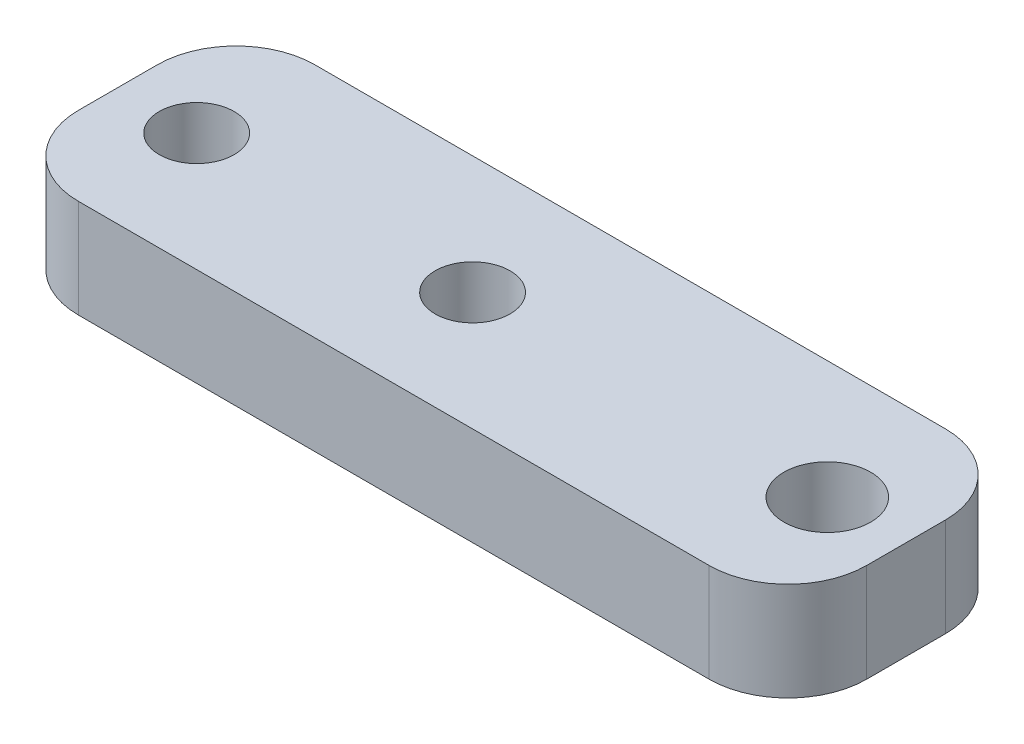
ISO-10303-21;
HEADER;
FILE_DESCRIPTION(('STEP AP214'),'2;1');
FILE_NAME('part.step','',(''),(''),'','','');
FILE_SCHEMA(('AUTOMOTIVE_DESIGN { 1 0 10303 214 1 1 1 1 }'));
ENDSEC;
DATA;
#1=APPLICATION_CONTEXT('core data for automotive mechanical design processes');
#2=APPLICATION_PROTOCOL_DEFINITION('international standard','automotive_design',2000,#1);
#3=PRODUCT_CONTEXT('',#1,'mechanical');
#4=PRODUCT('Part','Part','',(#3));
#5=PRODUCT_RELATED_PRODUCT_CATEGORY('part','',(#4));
#6=PRODUCT_DEFINITION_FORMATION('','',#4);
#7=PRODUCT_DEFINITION_CONTEXT('part definition',#1,'design');
#8=PRODUCT_DEFINITION('design','',#6,#7);
#9=PRODUCT_DEFINITION_SHAPE('','',#8);
#10=(LENGTH_UNIT() NAMED_UNIT(*) SI_UNIT(.MILLI.,.METRE.));
#11=(NAMED_UNIT(*) PLANE_ANGLE_UNIT() SI_UNIT($,.RADIAN.));
#12=(NAMED_UNIT(*) SI_UNIT($,.STERADIAN.) SOLID_ANGLE_UNIT());
#13=UNCERTAINTY_MEASURE_WITH_UNIT(LENGTH_MEASURE(1.E-05),#10,'distance_accuracy_value','');
#14=(GEOMETRIC_REPRESENTATION_CONTEXT(3) GLOBAL_UNCERTAINTY_ASSIGNED_CONTEXT((#13)) GLOBAL_UNIT_ASSIGNED_CONTEXT((#10,
#11,#12)) REPRESENTATION_CONTEXT('',''));
#15=CARTESIAN_POINT('',(0.,0.,0.));
#16=DIRECTION('',(0.,0.,1.));
#17=DIRECTION('',(1.,0.,0.));
#18=AXIS2_PLACEMENT_3D('',#15,#16,#17);
#19=CARTESIAN_POINT('',(10.0305939758537,2.5,0.));
#20=DIRECTION('',(1.,0.,0.));
#21=DIRECTION('',(0.,0.,-1.));
#22=AXIS2_PLACEMENT_3D('',#19,#20,#21);
#23=PLANE('',#22);
#24=DIRECTION('',(0.,0.,1.));
#25=VECTOR('',#24,1.);
#26=CARTESIAN_POINT('',(10.0305939758537,2.5,0.));
#27=LINE('',#26,#25);
#28=CARTESIAN_POINT('',(10.0305939758537,2.5,-4.));
#29=VERTEX_POINT('',#28);
#30=CARTESIAN_POINT('',(10.0305939758537,2.5,-2.));
#31=VERTEX_POINT('',#30);
#32=EDGE_CURVE('E119',#29,#31,#27,.T.);
#33=ORIENTED_EDGE('',*,*,#32,.F.);
#34=DIRECTION('',(0.,-1.,0.));
#35=VECTOR('',#34,1.);
#36=CARTESIAN_POINT('',(10.0305939758537,2.5,-4.));
#37=LINE('',#36,#35);
#38=CARTESIAN_POINT('',(10.0305939758537,0.,-4.));
#39=VERTEX_POINT('',#38);
#40=EDGE_CURVE('E104',#29,#39,#37,.T.);
#41=ORIENTED_EDGE('',*,*,#40,.T.);
#42=DIRECTION('',(0.,0.,1.));
#43=VECTOR('',#42,1.);
#44=CARTESIAN_POINT('',(10.0305939758537,0.,0.));
#45=LINE('',#44,#43);
#46=CARTESIAN_POINT('',(10.0305939758537,0.,-2.));
#47=VERTEX_POINT('',#46);
#48=EDGE_CURVE('E116',#39,#47,#45,.T.);
#49=ORIENTED_EDGE('',*,*,#48,.T.);
#50=DIRECTION('',(0.,-1.,0.));
#51=VECTOR('',#50,1.);
#52=CARTESIAN_POINT('',(10.0305939758537,2.5,-2.));
#53=LINE('',#52,#51);
#54=EDGE_CURVE('E121',#47,#31,#53,.F.);
#55=ORIENTED_EDGE('',*,*,#54,.T.);
#56=EDGE_LOOP('',(#33,#41,#49,#55));
#57=FACE_BOUND('',#56,.T.);
#58=ADVANCED_FACE('F35',(#57),#23,.F.);
#59=CARTESIAN_POINT('',(10.0305939758537,2.5,0.));
#60=DIRECTION('',(0.,0.,-1.));
#61=DIRECTION('',(-1.,0.,0.));
#62=AXIS2_PLACEMENT_3D('',#59,#60,#61);
#63=PLANE('',#62);
#64=DIRECTION('',(1.,0.,0.));
#65=VECTOR('',#64,1.);
#66=CARTESIAN_POINT('',(10.0305939758537,2.5,0.));
#67=LINE('',#66,#65);
#68=CARTESIAN_POINT('',(12.0305939758537,2.5,0.));
#69=VERTEX_POINT('',#68);
#70=CARTESIAN_POINT('',(28.0305939758537,2.5,0.));
#71=VERTEX_POINT('',#70);
#72=EDGE_CURVE('E174',#69,#71,#67,.T.);
#73=ORIENTED_EDGE('',*,*,#72,.F.);
#74=DIRECTION('',(0.,-1.,0.));
#75=VECTOR('',#74,1.);
#76=CARTESIAN_POINT('',(12.0305939758537,2.5,0.));
#77=LINE('',#76,#75);
#78=CARTESIAN_POINT('',(12.0305939758537,0.,0.));
#79=VERTEX_POINT('',#78);
#80=EDGE_CURVE('E158',#69,#79,#77,.T.);
#81=ORIENTED_EDGE('',*,*,#80,.T.);
#82=DIRECTION('',(1.,0.,0.));
#83=VECTOR('',#82,1.);
#84=CARTESIAN_POINT('',(10.0305939758537,0.,0.));
#85=LINE('',#84,#83);
#86=CARTESIAN_POINT('',(28.0305939758537,0.,0.));
#87=VERTEX_POINT('',#86);
#88=EDGE_CURVE('E125',#79,#87,#85,.T.);
#89=ORIENTED_EDGE('',*,*,#88,.T.);
#90=DIRECTION('',(0.,-1.,0.));
#91=VECTOR('',#90,1.);
#92=CARTESIAN_POINT('',(28.0305939758537,2.5,0.));
#93=LINE('',#92,#91);
#94=EDGE_CURVE('E156',#87,#71,#93,.F.);
#95=ORIENTED_EDGE('',*,*,#94,.T.);
#96=EDGE_LOOP('',(#73,#81,#89,#95));
#97=FACE_BOUND('',#96,.T.);
#98=ADVANCED_FACE('F223',(#97),#63,.F.);
#99=CARTESIAN_POINT('',(30.0305939758537,2.5,0.));
#100=DIRECTION('',(-1.,0.,0.));
#101=DIRECTION('',(0.,0.,1.));
#102=AXIS2_PLACEMENT_3D('',#99,#100,#101);
#103=PLANE('',#102);
#104=DIRECTION('',(0.,0.,-1.));
#105=VECTOR('',#104,1.);
#106=CARTESIAN_POINT('',(30.0305939758537,0.,0.));
#107=LINE('',#106,#105);
#108=CARTESIAN_POINT('',(30.0305939758537,0.,-2.));
#109=VERTEX_POINT('',#108);
#110=CARTESIAN_POINT('',(30.0305939758537,0.,-4.));
#111=VERTEX_POINT('',#110);
#112=EDGE_CURVE('E129',#109,#111,#107,.T.);
#113=ORIENTED_EDGE('',*,*,#112,.T.);
#114=DIRECTION('',(0.,-1.,0.));
#115=VECTOR('',#114,1.);
#116=CARTESIAN_POINT('',(30.0305939758537,2.5,-4.));
#117=LINE('',#116,#115);
#118=CARTESIAN_POINT('',(30.0305939758537,2.5,-4.));
#119=VERTEX_POINT('',#118);
#120=EDGE_CURVE('E11',#111,#119,#117,.F.);
#121=ORIENTED_EDGE('',*,*,#120,.T.);
#122=DIRECTION('',(0.,0.,-1.));
#123=VECTOR('',#122,1.);
#124=CARTESIAN_POINT('',(30.0305939758537,2.5,0.));
#125=LINE('',#124,#123);
#126=CARTESIAN_POINT('',(30.0305939758537,2.5,-2.));
#127=VERTEX_POINT('',#126);
#128=EDGE_CURVE('E164',#127,#119,#125,.T.);
#129=ORIENTED_EDGE('',*,*,#128,.F.);
#130=DIRECTION('',(0.,-1.,0.));
#131=VECTOR('',#130,1.);
#132=CARTESIAN_POINT('',(30.0305939758537,2.5,-2.));
#133=LINE('',#132,#131);
#134=EDGE_CURVE('E43',#127,#109,#133,.T.);
#135=ORIENTED_EDGE('',*,*,#134,.T.);
#136=EDGE_LOOP('',(#113,#121,#129,#135));
#137=FACE_BOUND('',#136,.T.);
#138=ADVANCED_FACE('F163',(#137),#103,.F.);
#139=CARTESIAN_POINT('',(10.0305939758537,2.5,-6.));
#140=DIRECTION('',(0.,0.,1.));
#141=DIRECTION('',(1.,0.,0.));
#142=AXIS2_PLACEMENT_3D('',#139,#140,#141);
#143=PLANE('',#142);
#144=DIRECTION('',(-1.,0.,0.));
#145=VECTOR('',#144,1.);
#146=CARTESIAN_POINT('',(10.0305939758537,0.,-6.));
#147=LINE('',#146,#145);
#148=CARTESIAN_POINT('',(28.0305939758537,0.,-6.));
#149=VERTEX_POINT('',#148);
#150=CARTESIAN_POINT('',(12.0305939758537,0.,-6.));
#151=VERTEX_POINT('',#150);
#152=EDGE_CURVE('E139',#149,#151,#147,.T.);
#153=ORIENTED_EDGE('',*,*,#152,.T.);
#154=DIRECTION('',(0.,-1.,0.));
#155=VECTOR('',#154,1.);
#156=CARTESIAN_POINT('',(12.0305939758537,2.5,-6.));
#157=LINE('',#156,#155);
#158=CARTESIAN_POINT('',(12.0305939758537,2.5,-6.));
#159=VERTEX_POINT('',#158);
#160=EDGE_CURVE('E105',#151,#159,#157,.F.);
#161=ORIENTED_EDGE('',*,*,#160,.T.);
#162=DIRECTION('',(-1.,0.,0.));
#163=VECTOR('',#162,1.);
#164=CARTESIAN_POINT('',(10.0305939758537,2.5,-6.));
#165=LINE('',#164,#163);
#166=CARTESIAN_POINT('',(28.0305939758537,2.5,-6.));
#167=VERTEX_POINT('',#166);
#168=EDGE_CURVE('E135',#167,#159,#165,.T.);
#169=ORIENTED_EDGE('',*,*,#168,.F.);
#170=DIRECTION('',(0.,-1.,0.));
#171=VECTOR('',#170,1.);
#172=CARTESIAN_POINT('',(28.0305939758537,2.5,-6.));
#173=LINE('',#172,#171);
#174=EDGE_CURVE('E110',#167,#149,#173,.T.);
#175=ORIENTED_EDGE('',*,*,#174,.T.);
#176=EDGE_LOOP('',(#153,#161,#169,#175));
#177=FACE_BOUND('',#176,.T.);
#178=ADVANCED_FACE('F172',(#177),#143,.F.);
#179=CARTESIAN_POINT('',(0.,2.5,0.));
#180=DIRECTION('',(0.,-1.,0.));
#181=DIRECTION('',(0.,0.,-1.));
#182=AXIS2_PLACEMENT_3D('',#179,#180,#181);
#183=PLANE('',#182);
#184=CARTESIAN_POINT('',(12.0305939758537,2.5,-3.));
#185=DIRECTION('',(0.,1.,0.));
#186=DIRECTION('',(0.,0.,1.));
#187=AXIS2_PLACEMENT_3D('',#184,#185,#186);
#188=CIRCLE('',#187,0.949999999999999);
#189=CARTESIAN_POINT('',(12.0305939758537,2.5,-2.05));
#190=VERTEX_POINT('',#189);
#191=EDGE_CURVE('E187',#190,#190,#188,.T.);
#192=ORIENTED_EDGE('',*,*,#191,.F.);
#193=EDGE_LOOP('',(#192));
#194=FACE_BOUND('',#193,.T.);
#195=CARTESIAN_POINT('',(19.0305939758537,2.5,-3.));
#196=DIRECTION('',(0.,1.,0.));
#197=DIRECTION('',(0.,0.,1.));
#198=AXIS2_PLACEMENT_3D('',#195,#196,#197);
#199=CIRCLE('',#198,0.950000000000001);
#200=CARTESIAN_POINT('',(19.0305939758537,2.5,-2.05));
#201=VERTEX_POINT('',#200);
#202=EDGE_CURVE('E181',#201,#201,#199,.T.);
#203=ORIENTED_EDGE('',*,*,#202,.F.);
#204=EDGE_LOOP('',(#203));
#205=FACE_BOUND('',#204,.T.);
#206=CARTESIAN_POINT('',(28.0305939758537,2.5,-3.));
#207=DIRECTION('',(0.,1.,0.));
#208=DIRECTION('',(0.,0.,1.));
#209=AXIS2_PLACEMENT_3D('',#206,#207,#208);
#210=CIRCLE('',#209,1.1);
#211=CARTESIAN_POINT('',(28.0305939758537,2.5,-1.9));
#212=VERTEX_POINT('',#211);
#213=EDGE_CURVE('E132',#212,#212,#210,.T.);
#214=ORIENTED_EDGE('',*,*,#213,.F.);
#215=EDGE_LOOP('',(#214));
#216=FACE_BOUND('',#215,.T.);
#217=ORIENTED_EDGE('',*,*,#168,.T.);
#218=CARTESIAN_POINT('',(12.0305939758537,2.5,-4.));
#219=DIRECTION('',(0.,-1.,0.));
#220=DIRECTION('',(0.,0.,-1.));
#221=AXIS2_PLACEMENT_3D('',#218,#219,#220);
#222=CIRCLE('',#221,2.);
#223=EDGE_CURVE('E154',#159,#29,#222,.F.);
#224=ORIENTED_EDGE('',*,*,#223,.T.);
#225=ORIENTED_EDGE('',*,*,#32,.T.);
#226=CARTESIAN_POINT('',(12.0305939758537,2.5,-2.));
#227=DIRECTION('',(0.,-1.,0.));
#228=DIRECTION('',(0.,0.,-1.));
#229=AXIS2_PLACEMENT_3D('',#226,#227,#228);
#230=CIRCLE('',#229,2.);
#231=EDGE_CURVE('E152',#31,#69,#230,.F.);
#232=ORIENTED_EDGE('',*,*,#231,.T.);
#233=ORIENTED_EDGE('',*,*,#72,.T.);
#234=CARTESIAN_POINT('',(28.0305939758537,2.5,-2.));
#235=DIRECTION('',(0.,-1.,0.));
#236=DIRECTION('',(0.,0.,-1.));
#237=AXIS2_PLACEMENT_3D('',#234,#235,#236);
#238=CIRCLE('',#237,2.);
#239=EDGE_CURVE('E55',#71,#127,#238,.F.);
#240=ORIENTED_EDGE('',*,*,#239,.T.);
#241=ORIENTED_EDGE('',*,*,#128,.T.);
#242=CARTESIAN_POINT('',(28.0305939758537,2.5,-4.));
#243=DIRECTION('',(0.,-1.,0.));
#244=DIRECTION('',(0.,0.,-1.));
#245=AXIS2_PLACEMENT_3D('',#242,#243,#244);
#246=CIRCLE('',#245,2.);
#247=EDGE_CURVE('E150',#119,#167,#246,.F.);
#248=ORIENTED_EDGE('',*,*,#247,.T.);
#249=EDGE_LOOP('',(#217,#224,#225,#232,#233,#240,#241,#248));
#250=FACE_BOUND('',#249,.T.);
#251=ADVANCED_FACE('F202',(#194,#205,#216,#250),#183,.F.);
#252=CARTESIAN_POINT('',(0.,0.,0.));
#253=DIRECTION('',(0.,-1.,0.));
#254=DIRECTION('',(0.,0.,-1.));
#255=AXIS2_PLACEMENT_3D('',#252,#253,#254);
#256=PLANE('',#255);
#257=CARTESIAN_POINT('',(12.0305939758537,0.,-3.));
#258=DIRECTION('',(0.,1.,0.));
#259=DIRECTION('',(0.,0.,1.));
#260=AXIS2_PLACEMENT_3D('',#257,#258,#259);
#261=CIRCLE('',#260,0.949999999999999);
#262=CARTESIAN_POINT('',(12.0305939758537,0.,-2.05));
#263=VERTEX_POINT('',#262);
#264=EDGE_CURVE('E179',#263,#263,#261,.T.);
#265=ORIENTED_EDGE('',*,*,#264,.T.);
#266=EDGE_LOOP('',(#265));
#267=FACE_BOUND('',#266,.T.);
#268=CARTESIAN_POINT('',(19.0305939758537,0.,-3.));
#269=DIRECTION('',(0.,1.,0.));
#270=DIRECTION('',(0.,0.,1.));
#271=AXIS2_PLACEMENT_3D('',#268,#269,#270);
#272=CIRCLE('',#271,0.950000000000001);
#273=CARTESIAN_POINT('',(19.0305939758537,0.,-2.05));
#274=VERTEX_POINT('',#273);
#275=EDGE_CURVE('E184',#274,#274,#272,.T.);
#276=ORIENTED_EDGE('',*,*,#275,.T.);
#277=EDGE_LOOP('',(#276));
#278=FACE_BOUND('',#277,.T.);
#279=CARTESIAN_POINT('',(28.0305939758537,0.,-3.));
#280=DIRECTION('',(0.,1.,0.));
#281=DIRECTION('',(0.,0.,1.));
#282=AXIS2_PLACEMENT_3D('',#279,#280,#281);
#283=CIRCLE('',#282,1.1);
#284=CARTESIAN_POINT('',(28.0305939758537,0.,-1.9));
#285=VERTEX_POINT('',#284);
#286=EDGE_CURVE('E126',#285,#285,#283,.T.);
#287=ORIENTED_EDGE('',*,*,#286,.T.);
#288=EDGE_LOOP('',(#287));
#289=FACE_BOUND('',#288,.T.);
#290=ORIENTED_EDGE('',*,*,#48,.F.);
#291=CARTESIAN_POINT('',(12.0305939758537,0.,-4.));
#292=DIRECTION('',(0.,-1.,0.));
#293=DIRECTION('',(0.,0.,-1.));
#294=AXIS2_PLACEMENT_3D('',#291,#292,#293);
#295=CIRCLE('',#294,2.);
#296=EDGE_CURVE('E100',#39,#151,#295,.T.);
#297=ORIENTED_EDGE('',*,*,#296,.T.);
#298=ORIENTED_EDGE('',*,*,#152,.F.);
#299=CARTESIAN_POINT('',(28.0305939758537,0.,-4.));
#300=DIRECTION('',(0.,-1.,0.));
#301=DIRECTION('',(0.,0.,-1.));
#302=AXIS2_PLACEMENT_3D('',#299,#300,#301);
#303=CIRCLE('',#302,2.);
#304=EDGE_CURVE('E143',#149,#111,#303,.T.);
#305=ORIENTED_EDGE('',*,*,#304,.T.);
#306=ORIENTED_EDGE('',*,*,#112,.F.);
#307=CARTESIAN_POINT('',(28.0305939758537,0.,-2.));
#308=DIRECTION('',(0.,-1.,0.));
#309=DIRECTION('',(0.,0.,-1.));
#310=AXIS2_PLACEMENT_3D('',#307,#308,#309);
#311=CIRCLE('',#310,2.);
#312=EDGE_CURVE('E120',#109,#87,#311,.T.);
#313=ORIENTED_EDGE('',*,*,#312,.T.);
#314=ORIENTED_EDGE('',*,*,#88,.F.);
#315=CARTESIAN_POINT('',(12.0305939758537,0.,-2.));
#316=DIRECTION('',(0.,-1.,0.));
#317=DIRECTION('',(0.,0.,-1.));
#318=AXIS2_PLACEMENT_3D('',#315,#316,#317);
#319=CIRCLE('',#318,2.);
#320=EDGE_CURVE('E111',#79,#47,#319,.T.);
#321=ORIENTED_EDGE('',*,*,#320,.T.);
#322=EDGE_LOOP('',(#290,#297,#298,#305,#306,#313,#314,#321));
#323=FACE_BOUND('',#322,.T.);
#324=ADVANCED_FACE('F123',(#267,#278,#289,#323),#256,.T.);
#325=CARTESIAN_POINT('',(28.0305939758537,0.,-3.));
#326=DIRECTION('',(0.,1.,0.));
#327=DIRECTION('',(0.,0.,1.));
#328=AXIS2_PLACEMENT_3D('',#325,#326,#327);
#329=CYLINDRICAL_SURFACE('',#328,1.1);
#330=ORIENTED_EDGE('',*,*,#286,.F.);
#331=EDGE_LOOP('',(#330));
#332=FACE_BOUND('',#331,.T.);
#333=ORIENTED_EDGE('',*,*,#213,.T.);
#334=EDGE_LOOP('',(#333));
#335=FACE_BOUND('',#334,.T.);
#336=ADVANCED_FACE('F210',(#332,#335),#329,.F.);
#337=CARTESIAN_POINT('',(19.0305939758537,0.,-3.));
#338=DIRECTION('',(0.,1.,0.));
#339=DIRECTION('',(0.,0.,1.));
#340=AXIS2_PLACEMENT_3D('',#337,#338,#339);
#341=CYLINDRICAL_SURFACE('',#340,0.950000000000001);
#342=ORIENTED_EDGE('',*,*,#275,.F.);
#343=EDGE_LOOP('',(#342));
#344=FACE_BOUND('',#343,.T.);
#345=ORIENTED_EDGE('',*,*,#202,.T.);
#346=EDGE_LOOP('',(#345));
#347=FACE_BOUND('',#346,.T.);
#348=ADVANCED_FACE('F198',(#344,#347),#341,.F.);
#349=CARTESIAN_POINT('',(12.0305939758537,0.,-3.));
#350=DIRECTION('',(0.,1.,0.));
#351=DIRECTION('',(0.,0.,1.));
#352=AXIS2_PLACEMENT_3D('',#349,#350,#351);
#353=CYLINDRICAL_SURFACE('',#352,0.949999999999999);
#354=ORIENTED_EDGE('',*,*,#264,.F.);
#355=EDGE_LOOP('',(#354));
#356=FACE_BOUND('',#355,.T.);
#357=ORIENTED_EDGE('',*,*,#191,.T.);
#358=EDGE_LOOP('',(#357));
#359=FACE_BOUND('',#358,.T.);
#360=ADVANCED_FACE('F195',(#356,#359),#353,.F.);
#361=CARTESIAN_POINT('',(12.0305939758537,2.5,-4.));
#362=DIRECTION('',(0.,-1.,0.));
#363=DIRECTION('',(0.,0.,-1.));
#364=AXIS2_PLACEMENT_3D('',#361,#362,#363);
#365=CYLINDRICAL_SURFACE('',#364,2.);
#366=ORIENTED_EDGE('',*,*,#223,.F.);
#367=ORIENTED_EDGE('',*,*,#160,.F.);
#368=ORIENTED_EDGE('',*,*,#296,.F.);
#369=ORIENTED_EDGE('',*,*,#40,.F.);
#370=EDGE_LOOP('',(#366,#367,#368,#369));
#371=FACE_BOUND('',#370,.T.);
#372=ADVANCED_FACE('F103',(#371),#365,.T.);
#373=CARTESIAN_POINT('',(12.0305939758537,2.5,-2.));
#374=DIRECTION('',(0.,-1.,0.));
#375=DIRECTION('',(0.,0.,-1.));
#376=AXIS2_PLACEMENT_3D('',#373,#374,#375);
#377=CYLINDRICAL_SURFACE('',#376,2.);
#378=ORIENTED_EDGE('',*,*,#231,.F.);
#379=ORIENTED_EDGE('',*,*,#54,.F.);
#380=ORIENTED_EDGE('',*,*,#320,.F.);
#381=ORIENTED_EDGE('',*,*,#80,.F.);
#382=EDGE_LOOP('',(#378,#379,#380,#381));
#383=FACE_BOUND('',#382,.T.);
#384=ADVANCED_FACE('F234',(#383),#377,.T.);
#385=CARTESIAN_POINT('',(28.0305939758537,2.5,-4.));
#386=DIRECTION('',(0.,-1.,0.));
#387=DIRECTION('',(0.,0.,-1.));
#388=AXIS2_PLACEMENT_3D('',#385,#386,#387);
#389=CYLINDRICAL_SURFACE('',#388,2.);
#390=ORIENTED_EDGE('',*,*,#247,.F.);
#391=ORIENTED_EDGE('',*,*,#120,.F.);
#392=ORIENTED_EDGE('',*,*,#304,.F.);
#393=ORIENTED_EDGE('',*,*,#174,.F.);
#394=EDGE_LOOP('',(#390,#391,#392,#393));
#395=FACE_BOUND('',#394,.T.);
#396=ADVANCED_FACE('F169',(#395),#389,.T.);
#397=CARTESIAN_POINT('',(28.0305939758537,2.5,-2.));
#398=DIRECTION('',(0.,-1.,0.));
#399=DIRECTION('',(0.,0.,-1.));
#400=AXIS2_PLACEMENT_3D('',#397,#398,#399);
#401=CYLINDRICAL_SURFACE('',#400,2.);
#402=ORIENTED_EDGE('',*,*,#239,.F.);
#403=ORIENTED_EDGE('',*,*,#94,.F.);
#404=ORIENTED_EDGE('',*,*,#312,.F.);
#405=ORIENTED_EDGE('',*,*,#134,.F.);
#406=EDGE_LOOP('',(#402,#403,#404,#405));
#407=FACE_BOUND('',#406,.T.);
#408=ADVANCED_FACE('F37',(#407),#401,.T.);
#409=CLOSED_SHELL('',(#58,#98,#138,#178,#251,#324,#336,#348,#360,#372,#384,#396,#408));
#410=MANIFOLD_SOLID_BREP('B2',#409);
#411=ADVANCED_BREP_SHAPE_REPRESENTATION('',(#18,#410),#14);
#412=SHAPE_DEFINITION_REPRESENTATION(#9,#411);
ENDSEC;
END-ISO-10303-21;
